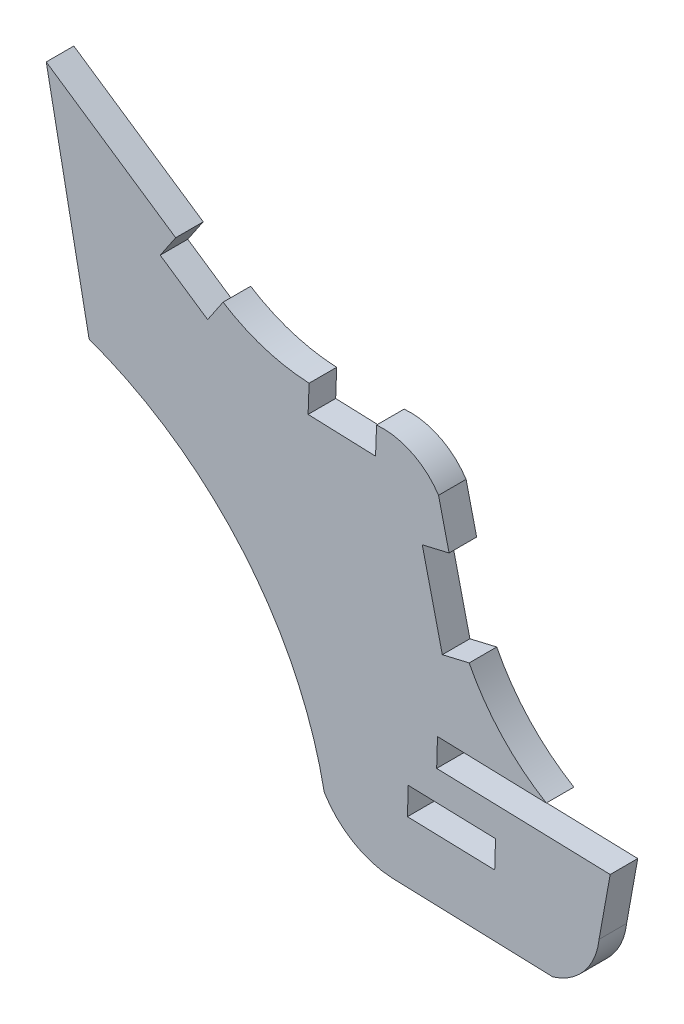
ISO-10303-21;
HEADER;
FILE_DESCRIPTION(('STEP AP214'),'2;1');
FILE_NAME('part.step','',(''),(''),'','','');
FILE_SCHEMA(('AUTOMOTIVE_DESIGN { 1 0 10303 214 1 1 1 1 }'));
ENDSEC;
DATA;
#1=APPLICATION_CONTEXT('core data for automotive mechanical design processes');
#2=APPLICATION_PROTOCOL_DEFINITION('international standard','automotive_design',2000,#1);
#3=PRODUCT_CONTEXT('',#1,'mechanical');
#4=PRODUCT('Part','Part','',(#3));
#5=PRODUCT_RELATED_PRODUCT_CATEGORY('part','',(#4));
#6=PRODUCT_DEFINITION_FORMATION('','',#4);
#7=PRODUCT_DEFINITION_CONTEXT('part definition',#1,'design');
#8=PRODUCT_DEFINITION('design','',#6,#7);
#9=PRODUCT_DEFINITION_SHAPE('','',#8);
#10=(LENGTH_UNIT() NAMED_UNIT(*) SI_UNIT(.MILLI.,.METRE.));
#11=(NAMED_UNIT(*) PLANE_ANGLE_UNIT() SI_UNIT($,.RADIAN.));
#12=(NAMED_UNIT(*) SI_UNIT($,.STERADIAN.) SOLID_ANGLE_UNIT());
#13=UNCERTAINTY_MEASURE_WITH_UNIT(LENGTH_MEASURE(1.E-05),#10,'distance_accuracy_value','');
#14=(GEOMETRIC_REPRESENTATION_CONTEXT(3) GLOBAL_UNCERTAINTY_ASSIGNED_CONTEXT((#13)) GLOBAL_UNIT_ASSIGNED_CONTEXT((#10,
#11,#12)) REPRESENTATION_CONTEXT('',''));
#15=CARTESIAN_POINT('',(0.,0.,0.));
#16=DIRECTION('',(0.,0.,1.));
#17=DIRECTION('',(1.,0.,0.));
#18=AXIS2_PLACEMENT_3D('',#15,#16,#17);
#19=CARTESIAN_POINT('',(468.96789565381,345.95297828372,3.));
#20=DIRECTION('',(0.,0.,1.));
#21=DIRECTION('',(1.,0.,0.));
#22=AXIS2_PLACEMENT_3D('',#19,#20,#21);
#23=PLANE('',#22);
#24=CARTESIAN_POINT('',(468.96789565381,345.95297828372,3.));
#25=DIRECTION('',(0.,0.,1.));
#26=DIRECTION('',(1.,0.,0.));
#27=AXIS2_PLACEMENT_3D('',#24,#25,#26);
#28=CIRCLE('',#27,9.19947991267672);
#29=CARTESIAN_POINT('',(461.126484264045,341.142292461491,3.));
#30=VERTEX_POINT('',#29);
#31=CARTESIAN_POINT('',(468.485101770501,336.76617575346,3.));
#32=VERTEX_POINT('',#31);
#33=EDGE_CURVE('E296',#30,#32,#28,.T.);
#34=ORIENTED_EDGE('',*,*,#33,.T.);
#35=DIRECTION('',(0.999455090325987,-0.0330079145277798,0.));
#36=VECTOR('',#35,1.);
#37=CARTESIAN_POINT('',(468.485101770501,336.76617575346,3.));
#38=LINE('',#37,#36);
#39=CARTESIAN_POINT('',(485.987733807601,336.188135391384,3.));
#40=VERTEX_POINT('',#39);
#41=EDGE_CURVE('E299',#32,#40,#38,.T.);
#42=ORIENTED_EDGE('',*,*,#41,.T.);
#43=CARTESIAN_POINT('',(483.92624753236,343.027897426941,3.));
#44=DIRECTION('',(0.,0.,1.));
#45=DIRECTION('',(1.,0.,0.));
#46=AXIS2_PLACEMENT_3D('',#43,#44,#45);
#47=CIRCLE('',#46,7.14367345040774);
#48=CARTESIAN_POINT('',(491.026498899204,342.241449149119,3.));
#49=VERTEX_POINT('',#48);
#50=EDGE_CURVE('E301',#40,#49,#47,.T.);
#51=ORIENTED_EDGE('',*,*,#50,.T.);
#52=DIRECTION('',(0.177327900129265,0.984151825601998,0.));
#53=VECTOR('',#52,1.);
#54=CARTESIAN_POINT('',(491.026498899204,342.241449149119,3.));
#55=LINE('',#54,#53);
#56=CARTESIAN_POINT('',(492.238136306161,348.965913630768,3.));
#57=VERTEX_POINT('',#56);
#58=EDGE_CURVE('E303',#49,#57,#55,.T.);
#59=ORIENTED_EDGE('',*,*,#58,.T.);
#60=DIRECTION('',(-0.999570165264995,0.0293169696952204,0.));
#61=VECTOR('',#60,1.);
#62=CARTESIAN_POINT('',(492.238136306161,348.965913630768,3.));
#63=LINE('',#62,#61);
#64=CARTESIAN_POINT('',(473.355716317311,349.519727013582,3.));
#65=VERTEX_POINT('',#64);
#66=EDGE_CURVE('E305',#57,#65,#63,.T.);
#67=ORIENTED_EDGE('',*,*,#66,.T.);
#68=DIRECTION('',(0.0293169696952107,0.999570165264995,0.));
#69=VECTOR('',#68,1.);
#70=CARTESIAN_POINT('',(473.355716317311,349.519727013582,3.));
#71=LINE('',#70,#69);
#72=CARTESIAN_POINT('',(473.445174068195,352.569813695993,3.));
#73=VERTEX_POINT('',#72);
#74=EDGE_CURVE('E307',#65,#73,#71,.T.);
#75=ORIENTED_EDGE('',*,*,#74,.T.);
#76=DIRECTION('',(0.999570165264995,-0.0293169696952187,0.));
#77=VECTOR('',#76,1.);
#78=CARTESIAN_POINT('',(473.445174068195,352.569813695993,3.));
#79=LINE('',#78,#77);
#80=CARTESIAN_POINT('',(485.286157605882,352.222522662708,3.));
#81=VERTEX_POINT('',#80);
#82=EDGE_CURVE('E309',#73,#81,#79,.T.);
#83=ORIENTED_EDGE('',*,*,#82,.T.);
#84=CARTESIAN_POINT('',(496.747935532261,371.31733561214,3.));
#85=DIRECTION('',(0.,0.,-1.));
#86=DIRECTION('',(1.,0.,0.));
#87=AXIS2_PLACEMENT_3D('',#84,#85,#86);
#88=CIRCLE('',#87,22.2707035094855);
#89=CARTESIAN_POINT('',(476.892234143935,361.230940954731,3.));
#90=VERTEX_POINT('',#89);
#91=EDGE_CURVE('E311',#81,#90,#88,.T.);
#92=ORIENTED_EDGE('',*,*,#91,.T.);
#93=DIRECTION('',(-0.973400938066721,-0.22910830140095,0.));
#94=VECTOR('',#93,1.);
#95=CARTESIAN_POINT('',(473.972031329734,360.543616050528,3.));
#96=LINE('',#95,#94);
#97=CARTESIAN_POINT('',(473.972031329734,360.543616050528,3.));
#98=VERTEX_POINT('',#97);
#99=EDGE_CURVE('E313',#90,#98,#96,.T.);
#100=ORIENTED_EDGE('',*,*,#99,.T.);
#101=DIRECTION('',(-0.229108301400947,0.973400938066721,0.));
#102=VECTOR('',#101,1.);
#103=CARTESIAN_POINT('',(471.790920300397,369.810392980924,3.));
#104=LINE('',#103,#102);
#105=CARTESIAN_POINT('',(471.790920300397,369.810392980924,3.));
#106=VERTEX_POINT('',#105);
#107=EDGE_CURVE('E315',#98,#106,#104,.T.);
#108=ORIENTED_EDGE('',*,*,#107,.T.);
#109=DIRECTION('',(0.973400938066721,0.229108301400947,0.));
#110=VECTOR('',#109,1.);
#111=CARTESIAN_POINT('',(471.790920300397,369.810392980924,3.));
#112=LINE('',#111,#110);
#113=CARTESIAN_POINT('',(474.705571911738,370.496411304654,3.));
#114=VERTEX_POINT('',#113);
#115=EDGE_CURVE('E317',#106,#114,#112,.T.);
#116=ORIENTED_EDGE('',*,*,#115,.T.);
#117=DIRECTION('',(-0.22910830140094,0.973400938066723,0.));
#118=VECTOR('',#117,1.);
#119=CARTESIAN_POINT('',(474.705571911738,370.496411304654,3.));
#120=LINE('',#119,#118);
#121=CARTESIAN_POINT('',(473.560151419854,375.362901844119,3.));
#122=VERTEX_POINT('',#121);
#123=EDGE_CURVE('E319',#114,#122,#120,.T.);
#124=ORIENTED_EDGE('',*,*,#123,.T.);
#125=CARTESIAN_POINT('',(467.477722075814,371.364785984137,3.));
#126=DIRECTION('',(0.,0.,1.));
#127=DIRECTION('',(1.,0.,0.));
#128=AXIS2_PLACEMENT_3D('',#125,#126,#127);
#129=CIRCLE('',#128,7.27879640840974);
#130=CARTESIAN_POINT('',(466.815212768636,378.613369195564,3.));
#131=VERTEX_POINT('',#130);
#132=EDGE_CURVE('E321',#122,#131,#129,.T.);
#133=ORIENTED_EDGE('',*,*,#132,.T.);
#134=DIRECTION('',(-0.036807561488547,-0.999322372118861,0.));
#135=VECTOR('',#134,1.);
#136=CARTESIAN_POINT('',(466.789188286835,377.906806580836,3.));
#137=LINE('',#136,#135);
#138=CARTESIAN_POINT('',(466.704790084171,375.615402079207,3.));
#139=VERTEX_POINT('',#138);
#140=EDGE_CURVE('E323',#131,#139,#137,.T.);
#141=ORIENTED_EDGE('',*,*,#140,.T.);
#142=DIRECTION('',(-0.999322372118862,0.0368075614885065,0.));
#143=VECTOR('',#142,1.);
#144=CARTESIAN_POINT('',(466.704790084171,375.615402079207,3.));
#145=LINE('',#144,#143);
#146=CARTESIAN_POINT('',(459.364790084171,375.885752777704,3.));
#147=VERTEX_POINT('',#146);
#148=EDGE_CURVE('E325',#139,#147,#145,.T.);
#149=ORIENTED_EDGE('',*,*,#148,.T.);
#150=DIRECTION('',(0.0368075614884959,0.999322372118863,0.));
#151=VECTOR('',#150,1.);
#152=CARTESIAN_POINT('',(459.364790084171,375.885752777704,3.));
#153=LINE('',#152,#151);
#154=CARTESIAN_POINT('',(459.475212768636,378.88371989406,3.));
#155=VERTEX_POINT('',#154);
#156=EDGE_CURVE('E327',#147,#155,#153,.T.);
#157=ORIENTED_EDGE('',*,*,#156,.T.);
#158=CARTESIAN_POINT('',(460.323516716727,397.881152780457,3.));
#159=DIRECTION('',(0.,0.,-1.));
#160=DIRECTION('',(1.,0.,0.));
#161=AXIS2_PLACEMENT_3D('',#158,#159,#160);
#162=CIRCLE('',#161,19.0163633710941);
#163=CARTESIAN_POINT('',(450.113675125507,381.838048014119,3.));
#164=VERTEX_POINT('',#163);
#165=EDGE_CURVE('E329',#155,#164,#162,.T.);
#166=ORIENTED_EDGE('',*,*,#165,.T.);
#167=DIRECTION('',(-0.560341990213033,-0.828261344023792,0.));
#168=VECTOR('',#167,1.);
#169=CARTESIAN_POINT('',(448.432649154868,379.353263982048,3.));
#170=LINE('',#169,#168);
#171=CARTESIAN_POINT('',(448.432649154868,379.353263982048,3.));
#172=VERTEX_POINT('',#171);
#173=EDGE_CURVE('E331',#164,#172,#170,.T.);
#174=ORIENTED_EDGE('',*,*,#173,.T.);
#175=DIRECTION('',(-0.828261344023792,0.560341990213031,0.));
#176=VECTOR('',#175,1.);
#177=CARTESIAN_POINT('',(448.432649154868,379.353263982048,3.));
#178=LINE('',#177,#176);
#179=CARTESIAN_POINT('',(443.2725809816,382.844194581075,3.));
#180=VERTEX_POINT('',#179);
#181=EDGE_CURVE('E333',#172,#180,#178,.T.);
#182=ORIENTED_EDGE('',*,*,#181,.T.);
#183=DIRECTION('',(0.560341990213037,0.828261344023789,0.));
#184=VECTOR('',#183,1.);
#185=CARTESIAN_POINT('',(443.2725809816,382.844194581075,3.));
#186=LINE('',#185,#184);
#187=CARTESIAN_POINT('',(444.953606952239,385.328978613146,3.));
#188=VERTEX_POINT('',#187);
#189=EDGE_CURVE('E335',#180,#188,#186,.T.);
#190=ORIENTED_EDGE('',*,*,#189,.T.);
#191=DIRECTION('',(-0.828261344023787,0.560341990213039,0.));
#192=VECTOR('',#191,1.);
#193=CARTESIAN_POINT('',(444.953606952239,385.328978613146,3.));
#194=LINE('',#193,#192);
#195=CARTESIAN_POINT('',(430.870547604675,394.85656258171,3.));
#196=VERTEX_POINT('',#195);
#197=EDGE_CURVE('E337',#188,#196,#194,.T.);
#198=ORIENTED_EDGE('',*,*,#197,.T.);
#199=DIRECTION('',(0.19231078912627,-0.981334071754177,0.));
#200=VECTOR('',#199,1.);
#201=CARTESIAN_POINT('',(431.688843489573,390.680917334372,3.));
#202=LINE('',#201,#200);
#203=CARTESIAN_POINT('',(435.532374472132,371.06793604422,3.));
#204=VERTEX_POINT('',#203);
#205=EDGE_CURVE('E339',#196,#204,#202,.T.);
#206=ORIENTED_EDGE('',*,*,#205,.T.);
#207=CARTESIAN_POINT('',(421.868375480799,333.474118313577,3.));
#208=DIRECTION('',(0.,0.,-1.));
#209=DIRECTION('',(1.,0.,0.));
#210=AXIS2_PLACEMENT_3D('',#207,#208,#209);
#211=CIRCLE('',#210,39.9999999999991);
#212=EDGE_CURVE('E341',#204,#30,#211,.T.);
#213=ORIENTED_EDGE('',*,*,#212,.T.);
#214=EDGE_LOOP('',(#34,#42,#51,#59,#67,#75,#83,#92,#100,#108,#116,#124,#133,#141,#149,#157,#166,
#174,#182,#190,#198,#206,#213));
#215=FACE_BOUND('',#214,.T.);
#216=DIRECTION('',(0.999570902873321,-0.0292918099306445,0.));
#217=VECTOR('',#216,1.);
#218=CARTESIAN_POINT('',(470.175766233134,343.382194877736,3.));
#219=LINE('',#218,#217);
#220=CARTESIAN_POINT('',(470.175766233134,343.382194877736,3.));
#221=VERTEX_POINT('',#220);
#222=CARTESIAN_POINT('',(479.671689810431,343.103922683395,3.));
#223=VERTEX_POINT('',#222);
#224=EDGE_CURVE('E237',#221,#223,#219,.T.);
#225=ORIENTED_EDGE('',*,*,#224,.F.);
#226=DIRECTION('',(-0.0292918099306476,-0.999570902873321,0.));
#227=VECTOR('',#226,1.);
#228=CARTESIAN_POINT('',(470.263641662926,346.380907586355,3.));
#229=LINE('',#228,#227);
#230=CARTESIAN_POINT('',(470.263641662926,346.380907586355,3.));
#231=VERTEX_POINT('',#230);
#232=EDGE_CURVE('E226',#231,#221,#229,.T.);
#233=ORIENTED_EDGE('',*,*,#232,.F.);
#234=DIRECTION('',(-0.999570902873321,0.0292918099306445,0.));
#235=VECTOR('',#234,1.);
#236=CARTESIAN_POINT('',(479.759565240223,346.102635392014,3.));
#237=LINE('',#236,#235);
#238=CARTESIAN_POINT('',(479.759565240223,346.102635392014,3.));
#239=VERTEX_POINT('',#238);
#240=EDGE_CURVE('E241',#239,#231,#237,.T.);
#241=ORIENTED_EDGE('',*,*,#240,.F.);
#242=DIRECTION('',(0.0292918099306476,0.999570902873321,0.));
#243=VECTOR('',#242,1.);
#244=CARTESIAN_POINT('',(479.671689810431,343.103922683395,3.));
#245=LINE('',#244,#243);
#246=EDGE_CURVE('E239',#223,#239,#245,.T.);
#247=ORIENTED_EDGE('',*,*,#246,.F.);
#248=EDGE_LOOP('',(#225,#233,#241,#247));
#249=FACE_BOUND('',#248,.T.);
#250=ADVANCED_FACE('F32',(#215,#249),#23,.T.);
#251=CARTESIAN_POINT('',(468.96789565381,345.95297828372,0.));
#252=DIRECTION('',(0.,0.,1.));
#253=DIRECTION('',(1.,0.,0.));
#254=AXIS2_PLACEMENT_3D('',#251,#252,#253);
#255=PLANE('',#254);
#256=CARTESIAN_POINT('',(468.96789565381,345.95297828372,0.));
#257=DIRECTION('',(0.,0.,1.));
#258=DIRECTION('',(1.,0.,0.));
#259=AXIS2_PLACEMENT_3D('',#256,#257,#258);
#260=CIRCLE('',#259,9.19947991267672);
#261=CARTESIAN_POINT('',(461.126484264045,341.142292461491,0.));
#262=VERTEX_POINT('',#261);
#263=CARTESIAN_POINT('',(468.485101770501,336.76617575346,0.));
#264=VERTEX_POINT('',#263);
#265=EDGE_CURVE('E227',#262,#264,#260,.T.);
#266=ORIENTED_EDGE('',*,*,#265,.F.);
#267=CARTESIAN_POINT('',(421.868375480799,333.474118313577,0.));
#268=DIRECTION('',(0.,0.,-1.));
#269=DIRECTION('',(1.,0.,0.));
#270=AXIS2_PLACEMENT_3D('',#267,#268,#269);
#271=CIRCLE('',#270,39.9999999999991);
#272=CARTESIAN_POINT('',(435.532374472132,371.06793604422,0.));
#273=VERTEX_POINT('',#272);
#274=EDGE_CURVE('E294',#273,#262,#271,.T.);
#275=ORIENTED_EDGE('',*,*,#274,.F.);
#276=DIRECTION('',(0.192310789126264,-0.981334071754178,0.));
#277=VECTOR('',#276,1.);
#278=CARTESIAN_POINT('',(431.688843489573,390.680917334372,0.));
#279=LINE('',#278,#277);
#280=CARTESIAN_POINT('',(430.870547604675,394.85656258171,0.));
#281=VERTEX_POINT('',#280);
#282=EDGE_CURVE('E292',#281,#273,#279,.T.);
#283=ORIENTED_EDGE('',*,*,#282,.F.);
#284=DIRECTION('',(-0.828261344023787,0.560341990213039,0.));
#285=VECTOR('',#284,1.);
#286=CARTESIAN_POINT('',(433.369869460212,393.165701366443,0.));
#287=LINE('',#286,#285);
#288=CARTESIAN_POINT('',(444.953606952239,385.328978613146,0.));
#289=VERTEX_POINT('',#288);
#290=EDGE_CURVE('E289',#289,#281,#287,.T.);
#291=ORIENTED_EDGE('',*,*,#290,.F.);
#292=DIRECTION('',(0.560341990213037,0.828261344023789,0.));
#293=VECTOR('',#292,1.);
#294=CARTESIAN_POINT('',(443.2725809816,382.844194581075,0.));
#295=LINE('',#294,#293);
#296=CARTESIAN_POINT('',(443.2725809816,382.844194581075,0.));
#297=VERTEX_POINT('',#296);
#298=EDGE_CURVE('E286',#297,#289,#295,.T.);
#299=ORIENTED_EDGE('',*,*,#298,.F.);
#300=DIRECTION('',(-0.828261344023792,0.560341990213031,0.));
#301=VECTOR('',#300,1.);
#302=CARTESIAN_POINT('',(448.432649154868,379.353263982048,0.));
#303=LINE('',#302,#301);
#304=CARTESIAN_POINT('',(448.432649154868,379.353263982048,0.));
#305=VERTEX_POINT('',#304);
#306=EDGE_CURVE('E284',#305,#297,#303,.T.);
#307=ORIENTED_EDGE('',*,*,#306,.F.);
#308=DIRECTION('',(-0.560341990213033,-0.828261344023792,0.));
#309=VECTOR('',#308,1.);
#310=CARTESIAN_POINT('',(448.432649154868,379.353263982048,0.));
#311=LINE('',#310,#309);
#312=CARTESIAN_POINT('',(450.113675125507,381.838048014119,0.));
#313=VERTEX_POINT('',#312);
#314=EDGE_CURVE('E282',#313,#305,#311,.T.);
#315=ORIENTED_EDGE('',*,*,#314,.F.);
#316=CARTESIAN_POINT('',(460.323516716727,397.881152780457,0.));
#317=DIRECTION('',(0.,0.,-1.));
#318=DIRECTION('',(1.,0.,0.));
#319=AXIS2_PLACEMENT_3D('',#316,#317,#318);
#320=CIRCLE('',#319,19.0163633710941);
#321=CARTESIAN_POINT('',(459.475212768636,378.88371989406,0.));
#322=VERTEX_POINT('',#321);
#323=EDGE_CURVE('E280',#322,#313,#320,.T.);
#324=ORIENTED_EDGE('',*,*,#323,.F.);
#325=DIRECTION('',(0.0368075614884959,0.999322372118863,0.));
#326=VECTOR('',#325,1.);
#327=CARTESIAN_POINT('',(459.364790084171,375.885752777704,0.));
#328=LINE('',#327,#326);
#329=CARTESIAN_POINT('',(459.364790084171,375.885752777704,0.));
#330=VERTEX_POINT('',#329);
#331=EDGE_CURVE('E278',#330,#322,#328,.T.);
#332=ORIENTED_EDGE('',*,*,#331,.F.);
#333=DIRECTION('',(-0.999322372118862,0.0368075614885065,0.));
#334=VECTOR('',#333,1.);
#335=CARTESIAN_POINT('',(466.704790084171,375.615402079207,0.));
#336=LINE('',#335,#334);
#337=CARTESIAN_POINT('',(466.704790084171,375.615402079207,0.));
#338=VERTEX_POINT('',#337);
#339=EDGE_CURVE('E276',#338,#330,#336,.T.);
#340=ORIENTED_EDGE('',*,*,#339,.F.);
#341=DIRECTION('',(-0.0368075614885204,-0.999322372118862,0.));
#342=VECTOR('',#341,1.);
#343=CARTESIAN_POINT('',(466.789188286835,377.906806580836,0.));
#344=LINE('',#343,#342);
#345=CARTESIAN_POINT('',(466.815212768636,378.613369195564,0.));
#346=VERTEX_POINT('',#345);
#347=EDGE_CURVE('E274',#346,#338,#344,.T.);
#348=ORIENTED_EDGE('',*,*,#347,.F.);
#349=CARTESIAN_POINT('',(467.477722075814,371.364785984137,0.));
#350=DIRECTION('',(0.,0.,1.));
#351=DIRECTION('',(1.,0.,0.));
#352=AXIS2_PLACEMENT_3D('',#349,#350,#351);
#353=CIRCLE('',#352,7.27879640840974);
#354=CARTESIAN_POINT('',(473.560151419854,375.362901844119,0.));
#355=VERTEX_POINT('',#354);
#356=EDGE_CURVE('E271',#355,#346,#353,.T.);
#357=ORIENTED_EDGE('',*,*,#356,.F.);
#358=DIRECTION('',(-0.22910830140094,0.973400938066723,0.));
#359=VECTOR('',#358,1.);
#360=CARTESIAN_POINT('',(474.705571911738,370.496411304654,0.));
#361=LINE('',#360,#359);
#362=CARTESIAN_POINT('',(474.705571911738,370.496411304654,0.));
#363=VERTEX_POINT('',#362);
#364=EDGE_CURVE('E269',#363,#355,#361,.T.);
#365=ORIENTED_EDGE('',*,*,#364,.F.);
#366=DIRECTION('',(0.973400938066721,0.229108301400947,0.));
#367=VECTOR('',#366,1.);
#368=CARTESIAN_POINT('',(471.790920300397,369.810392980924,0.));
#369=LINE('',#368,#367);
#370=CARTESIAN_POINT('',(471.790920300397,369.810392980924,0.));
#371=VERTEX_POINT('',#370);
#372=EDGE_CURVE('E267',#371,#363,#369,.T.);
#373=ORIENTED_EDGE('',*,*,#372,.F.);
#374=DIRECTION('',(-0.229108301400947,0.973400938066721,0.));
#375=VECTOR('',#374,1.);
#376=CARTESIAN_POINT('',(471.790920300397,369.810392980924,0.));
#377=LINE('',#376,#375);
#378=CARTESIAN_POINT('',(473.972031329734,360.543616050528,0.));
#379=VERTEX_POINT('',#378);
#380=EDGE_CURVE('E265',#379,#371,#377,.T.);
#381=ORIENTED_EDGE('',*,*,#380,.F.);
#382=DIRECTION('',(-0.973400938066721,-0.22910830140095,0.));
#383=VECTOR('',#382,1.);
#384=CARTESIAN_POINT('',(473.972031329734,360.543616050528,0.));
#385=LINE('',#384,#383);
#386=CARTESIAN_POINT('',(476.892234143935,361.230940954731,0.));
#387=VERTEX_POINT('',#386);
#388=EDGE_CURVE('E263',#387,#379,#385,.T.);
#389=ORIENTED_EDGE('',*,*,#388,.F.);
#390=CARTESIAN_POINT('',(496.747935532261,371.31733561214,0.));
#391=DIRECTION('',(0.,0.,-1.));
#392=DIRECTION('',(1.,0.,0.));
#393=AXIS2_PLACEMENT_3D('',#390,#391,#392);
#394=CIRCLE('',#393,22.2707035094855);
#395=CARTESIAN_POINT('',(485.286157605882,352.222522662708,0.));
#396=VERTEX_POINT('',#395);
#397=EDGE_CURVE('E261',#396,#387,#394,.T.);
#398=ORIENTED_EDGE('',*,*,#397,.F.);
#399=DIRECTION('',(0.999570165264995,-0.0293169696952187,0.));
#400=VECTOR('',#399,1.);
#401=CARTESIAN_POINT('',(473.445174068195,352.569813695993,0.));
#402=LINE('',#401,#400);
#403=CARTESIAN_POINT('',(473.445174068195,352.569813695993,0.));
#404=VERTEX_POINT('',#403);
#405=EDGE_CURVE('E259',#404,#396,#402,.T.);
#406=ORIENTED_EDGE('',*,*,#405,.F.);
#407=DIRECTION('',(0.0293169696952107,0.999570165264995,0.));
#408=VECTOR('',#407,1.);
#409=CARTESIAN_POINT('',(473.355716317311,349.519727013582,0.));
#410=LINE('',#409,#408);
#411=CARTESIAN_POINT('',(473.355716317311,349.519727013582,0.));
#412=VERTEX_POINT('',#411);
#413=EDGE_CURVE('E257',#412,#404,#410,.T.);
#414=ORIENTED_EDGE('',*,*,#413,.F.);
#415=DIRECTION('',(-0.999570165264995,0.0293169696952204,0.));
#416=VECTOR('',#415,1.);
#417=CARTESIAN_POINT('',(492.238136306161,348.965913630768,0.));
#418=LINE('',#417,#416);
#419=CARTESIAN_POINT('',(492.238136306161,348.965913630768,0.));
#420=VERTEX_POINT('',#419);
#421=EDGE_CURVE('E255',#420,#412,#418,.T.);
#422=ORIENTED_EDGE('',*,*,#421,.F.);
#423=DIRECTION('',(0.177327900129265,0.984151825601998,0.));
#424=VECTOR('',#423,1.);
#425=CARTESIAN_POINT('',(491.026498899204,342.241449149119,0.));
#426=LINE('',#425,#424);
#427=CARTESIAN_POINT('',(491.026498899204,342.241449149119,0.));
#428=VERTEX_POINT('',#427);
#429=EDGE_CURVE('E253',#428,#420,#426,.T.);
#430=ORIENTED_EDGE('',*,*,#429,.F.);
#431=CARTESIAN_POINT('',(483.92624753236,343.027897426941,0.));
#432=DIRECTION('',(0.,0.,1.));
#433=DIRECTION('',(1.,0.,0.));
#434=AXIS2_PLACEMENT_3D('',#431,#432,#433);
#435=CIRCLE('',#434,7.14367345040774);
#436=CARTESIAN_POINT('',(485.987733807601,336.188135391384,0.));
#437=VERTEX_POINT('',#436);
#438=EDGE_CURVE('E251',#437,#428,#435,.T.);
#439=ORIENTED_EDGE('',*,*,#438,.F.);
#440=DIRECTION('',(0.999455090325987,-0.0330079145277798,0.));
#441=VECTOR('',#440,1.);
#442=CARTESIAN_POINT('',(468.485101770501,336.76617575346,0.));
#443=LINE('',#442,#441);
#444=EDGE_CURVE('E249',#264,#437,#443,.T.);
#445=ORIENTED_EDGE('',*,*,#444,.F.);
#446=EDGE_LOOP('',(#266,#275,#283,#291,#299,#307,#315,#324,#332,#340,#348,#357,#365,#373,#381,
#389,#398,#406,#414,#422,#430,#439,#445));
#447=FACE_BOUND('',#446,.T.);
#448=DIRECTION('',(-0.0292918099306476,-0.999570902873321,0.));
#449=VECTOR('',#448,1.);
#450=CARTESIAN_POINT('',(470.263641662926,346.380907586355,0.));
#451=LINE('',#450,#449);
#452=CARTESIAN_POINT('',(470.263641662926,346.380907586355,0.));
#453=VERTEX_POINT('',#452);
#454=CARTESIAN_POINT('',(470.175766233134,343.382194877736,0.));
#455=VERTEX_POINT('',#454);
#456=EDGE_CURVE('E55',#453,#455,#451,.T.);
#457=ORIENTED_EDGE('',*,*,#456,.T.);
#458=DIRECTION('',(0.999570902873321,-0.0292918099306445,0.));
#459=VECTOR('',#458,1.);
#460=CARTESIAN_POINT('',(470.175766233134,343.382194877736,0.));
#461=LINE('',#460,#459);
#462=CARTESIAN_POINT('',(479.671689810431,343.103922683395,0.));
#463=VERTEX_POINT('',#462);
#464=EDGE_CURVE('E213',#455,#463,#461,.T.);
#465=ORIENTED_EDGE('',*,*,#464,.T.);
#466=DIRECTION('',(0.0292918099306476,0.999570902873321,0.));
#467=VECTOR('',#466,1.);
#468=CARTESIAN_POINT('',(479.671689810431,343.103922683395,0.));
#469=LINE('',#468,#467);
#470=CARTESIAN_POINT('',(479.759565240223,346.102635392014,0.));
#471=VERTEX_POINT('',#470);
#472=EDGE_CURVE('E222',#463,#471,#469,.T.);
#473=ORIENTED_EDGE('',*,*,#472,.T.);
#474=DIRECTION('',(-0.999570902873321,0.0292918099306445,0.));
#475=VECTOR('',#474,1.);
#476=CARTESIAN_POINT('',(479.759565240223,346.102635392014,0.));
#477=LINE('',#476,#475);
#478=EDGE_CURVE('E231',#471,#453,#477,.T.);
#479=ORIENTED_EDGE('',*,*,#478,.T.);
#480=EDGE_LOOP('',(#457,#465,#473,#479));
#481=FACE_BOUND('',#480,.T.);
#482=ADVANCED_FACE('F230',(#447,#481),#255,.F.);
#483=CARTESIAN_POINT('',(468.96789565381,345.95297828372,3.));
#484=DIRECTION('',(0.,0.,-1.));
#485=DIRECTION('',(-1.,0.,0.));
#486=AXIS2_PLACEMENT_3D('',#483,#484,#485);
#487=CYLINDRICAL_SURFACE('',#486,9.19947991267672);
#488=ORIENTED_EDGE('',*,*,#265,.T.);
#489=DIRECTION('',(0.,0.,-1.));
#490=VECTOR('',#489,1.);
#491=CARTESIAN_POINT('',(468.485101770501,336.76617575346,3.));
#492=LINE('',#491,#490);
#493=EDGE_CURVE('E11',#32,#264,#492,.T.);
#494=ORIENTED_EDGE('',*,*,#493,.F.);
#495=ORIENTED_EDGE('',*,*,#33,.F.);
#496=DIRECTION('',(0.,0.,-1.));
#497=VECTOR('',#496,1.);
#498=CARTESIAN_POINT('',(461.126484264045,341.142292461491,3.));
#499=LINE('',#498,#497);
#500=EDGE_CURVE('E343',#30,#262,#499,.T.);
#501=ORIENTED_EDGE('',*,*,#500,.T.);
#502=EDGE_LOOP('',(#488,#494,#495,#501));
#503=FACE_BOUND('',#502,.T.);
#504=ADVANCED_FACE('F34',(#503),#487,.T.);
#505=CARTESIAN_POINT('',(468.485101770501,336.76617575346,3.));
#506=DIRECTION('',(0.0330079145277797,0.999455090325987,0.));
#507=DIRECTION('',(-0.999455090325987,0.0330079145277798,0.));
#508=AXIS2_PLACEMENT_3D('',#505,#506,#507);
#509=PLANE('',#508);
#510=ORIENTED_EDGE('',*,*,#444,.T.);
#511=DIRECTION('',(0.,0.,-1.));
#512=VECTOR('',#511,1.);
#513=CARTESIAN_POINT('',(485.987733807601,336.188135391384,3.));
#514=LINE('',#513,#512);
#515=EDGE_CURVE('E40',#40,#437,#514,.T.);
#516=ORIENTED_EDGE('',*,*,#515,.F.);
#517=ORIENTED_EDGE('',*,*,#41,.F.);
#518=ORIENTED_EDGE('',*,*,#493,.T.);
#519=EDGE_LOOP('',(#510,#516,#517,#518));
#520=FACE_BOUND('',#519,.T.);
#521=ADVANCED_FACE('F432',(#520),#509,.F.);
#522=CARTESIAN_POINT('',(483.92624753236,343.027897426941,3.));
#523=DIRECTION('',(0.,0.,-1.));
#524=DIRECTION('',(-1.,0.,0.));
#525=AXIS2_PLACEMENT_3D('',#522,#523,#524);
#526=CYLINDRICAL_SURFACE('',#525,7.14367345040774);
#527=ORIENTED_EDGE('',*,*,#438,.T.);
#528=DIRECTION('',(0.,0.,-1.));
#529=VECTOR('',#528,1.);
#530=CARTESIAN_POINT('',(491.026498899204,342.241449149119,3.));
#531=LINE('',#530,#529);
#532=EDGE_CURVE('E403',#49,#428,#531,.T.);
#533=ORIENTED_EDGE('',*,*,#532,.F.);
#534=ORIENTED_EDGE('',*,*,#50,.F.);
#535=ORIENTED_EDGE('',*,*,#515,.T.);
#536=EDGE_LOOP('',(#527,#533,#534,#535));
#537=FACE_BOUND('',#536,.T.);
#538=ADVANCED_FACE('F410',(#537),#526,.T.);
#539=CARTESIAN_POINT('',(491.026498899204,342.241449149119,3.));
#540=DIRECTION('',(-0.984151825601998,0.177327900129264,0.));
#541=DIRECTION('',(-0.177327900129265,-0.984151825601998,0.));
#542=AXIS2_PLACEMENT_3D('',#539,#540,#541);
#543=PLANE('',#542);
#544=ORIENTED_EDGE('',*,*,#429,.T.);
#545=DIRECTION('',(0.,0.,-1.));
#546=VECTOR('',#545,1.);
#547=CARTESIAN_POINT('',(492.238136306161,348.965913630768,3.));
#548=LINE('',#547,#546);
#549=EDGE_CURVE('E400',#57,#420,#548,.T.);
#550=ORIENTED_EDGE('',*,*,#549,.F.);
#551=ORIENTED_EDGE('',*,*,#58,.F.);
#552=ORIENTED_EDGE('',*,*,#532,.T.);
#553=EDGE_LOOP('',(#544,#550,#551,#552));
#554=FACE_BOUND('',#553,.T.);
#555=ADVANCED_FACE('F420',(#554),#543,.F.);
#556=CARTESIAN_POINT('',(492.238136306161,348.965913630768,3.));
#557=DIRECTION('',(-0.0293169696952204,-0.999570165264995,0.));
#558=DIRECTION('',(0.999570165264995,-0.0293169696952204,0.));
#559=AXIS2_PLACEMENT_3D('',#556,#557,#558);
#560=PLANE('',#559);
#561=ORIENTED_EDGE('',*,*,#421,.T.);
#562=DIRECTION('',(0.,0.,-1.));
#563=VECTOR('',#562,1.);
#564=CARTESIAN_POINT('',(473.355716317311,349.519727013582,3.));
#565=LINE('',#564,#563);
#566=EDGE_CURVE('E397',#65,#412,#565,.T.);
#567=ORIENTED_EDGE('',*,*,#566,.F.);
#568=ORIENTED_EDGE('',*,*,#66,.F.);
#569=ORIENTED_EDGE('',*,*,#549,.T.);
#570=EDGE_LOOP('',(#561,#567,#568,#569));
#571=FACE_BOUND('',#570,.T.);
#572=ADVANCED_FACE('F424',(#571),#560,.F.);
#573=CARTESIAN_POINT('',(473.355716317311,349.519727013582,3.));
#574=DIRECTION('',(-0.999570165264995,0.0293169696952107,0.));
#575=DIRECTION('',(-0.0293169696952107,-0.999570165264995,0.));
#576=AXIS2_PLACEMENT_3D('',#573,#574,#575);
#577=PLANE('',#576);
#578=ORIENTED_EDGE('',*,*,#413,.T.);
#579=DIRECTION('',(0.,0.,-1.));
#580=VECTOR('',#579,1.);
#581=CARTESIAN_POINT('',(473.445174068195,352.569813695993,3.));
#582=LINE('',#581,#580);
#583=EDGE_CURVE('E394',#73,#404,#582,.T.);
#584=ORIENTED_EDGE('',*,*,#583,.F.);
#585=ORIENTED_EDGE('',*,*,#74,.F.);
#586=ORIENTED_EDGE('',*,*,#566,.T.);
#587=EDGE_LOOP('',(#578,#584,#585,#586));
#588=FACE_BOUND('',#587,.T.);
#589=ADVANCED_FACE('F517',(#588),#577,.F.);
#590=CARTESIAN_POINT('',(473.445174068195,352.569813695993,3.));
#591=DIRECTION('',(0.0293169696952187,0.999570165264995,0.));
#592=DIRECTION('',(-0.999570165264995,0.0293169696952187,0.));
#593=AXIS2_PLACEMENT_3D('',#590,#591,#592);
#594=PLANE('',#593);
#595=ORIENTED_EDGE('',*,*,#405,.T.);
#596=DIRECTION('',(0.,0.,-1.));
#597=VECTOR('',#596,1.);
#598=CARTESIAN_POINT('',(485.286157605882,352.222522662708,3.));
#599=LINE('',#598,#597);
#600=EDGE_CURVE('E391',#81,#396,#599,.T.);
#601=ORIENTED_EDGE('',*,*,#600,.F.);
#602=ORIENTED_EDGE('',*,*,#82,.F.);
#603=ORIENTED_EDGE('',*,*,#583,.T.);
#604=EDGE_LOOP('',(#595,#601,#602,#603));
#605=FACE_BOUND('',#604,.T.);
#606=ADVANCED_FACE('F515',(#605),#594,.F.);
#607=CARTESIAN_POINT('',(496.747935532261,371.31733561214,3.));
#608=DIRECTION('',(0.,0.,-1.));
#609=DIRECTION('',(-1.,0.,0.));
#610=AXIS2_PLACEMENT_3D('',#607,#608,#609);
#611=CYLINDRICAL_SURFACE('',#610,22.2707035094855);
#612=ORIENTED_EDGE('',*,*,#397,.T.);
#613=DIRECTION('',(0.,0.,-1.));
#614=VECTOR('',#613,1.);
#615=CARTESIAN_POINT('',(476.892234143935,361.230940954731,3.));
#616=LINE('',#615,#614);
#617=EDGE_CURVE('E388',#90,#387,#616,.T.);
#618=ORIENTED_EDGE('',*,*,#617,.F.);
#619=ORIENTED_EDGE('',*,*,#91,.F.);
#620=ORIENTED_EDGE('',*,*,#600,.T.);
#621=EDGE_LOOP('',(#612,#618,#619,#620));
#622=FACE_BOUND('',#621,.T.);
#623=ADVANCED_FACE('F511',(#622),#611,.F.);
#624=CARTESIAN_POINT('',(473.972031329734,360.543616050528,3.));
#625=DIRECTION('',(0.22910830140095,-0.97340093806672,0.));
#626=DIRECTION('',(0.973400938066721,0.22910830140095,0.));
#627=AXIS2_PLACEMENT_3D('',#624,#625,#626);
#628=PLANE('',#627);
#629=ORIENTED_EDGE('',*,*,#388,.T.);
#630=DIRECTION('',(0.,0.,-1.));
#631=VECTOR('',#630,1.);
#632=CARTESIAN_POINT('',(473.972031329734,360.543616050528,3.));
#633=LINE('',#632,#631);
#634=EDGE_CURVE('E385',#98,#379,#633,.T.);
#635=ORIENTED_EDGE('',*,*,#634,.F.);
#636=ORIENTED_EDGE('',*,*,#99,.F.);
#637=ORIENTED_EDGE('',*,*,#617,.T.);
#638=EDGE_LOOP('',(#629,#635,#636,#637));
#639=FACE_BOUND('',#638,.T.);
#640=ADVANCED_FACE('F506',(#639),#628,.F.);
#641=CARTESIAN_POINT('',(471.790920300397,369.810392980924,3.));
#642=DIRECTION('',(-0.973400938066721,-0.229108301400947,0.));
#643=DIRECTION('',(0.229108301400947,-0.973400938066721,0.));
#644=AXIS2_PLACEMENT_3D('',#641,#642,#643);
#645=PLANE('',#644);
#646=ORIENTED_EDGE('',*,*,#380,.T.);
#647=DIRECTION('',(0.,0.,-1.));
#648=VECTOR('',#647,1.);
#649=CARTESIAN_POINT('',(471.790920300397,369.810392980924,3.));
#650=LINE('',#649,#648);
#651=EDGE_CURVE('E382',#106,#371,#650,.T.);
#652=ORIENTED_EDGE('',*,*,#651,.F.);
#653=ORIENTED_EDGE('',*,*,#107,.F.);
#654=ORIENTED_EDGE('',*,*,#634,.T.);
#655=EDGE_LOOP('',(#646,#652,#653,#654));
#656=FACE_BOUND('',#655,.T.);
#657=ADVANCED_FACE('F500',(#656),#645,.F.);
#658=CARTESIAN_POINT('',(471.790920300397,369.810392980924,3.));
#659=DIRECTION('',(-0.229108301400947,0.973400938066721,0.));
#660=DIRECTION('',(-0.973400938066721,-0.229108301400947,0.));
#661=AXIS2_PLACEMENT_3D('',#658,#659,#660);
#662=PLANE('',#661);
#663=ORIENTED_EDGE('',*,*,#372,.T.);
#664=DIRECTION('',(0.,0.,-1.));
#665=VECTOR('',#664,1.);
#666=CARTESIAN_POINT('',(474.705571911738,370.496411304654,3.));
#667=LINE('',#666,#665);
#668=EDGE_CURVE('E379',#114,#363,#667,.T.);
#669=ORIENTED_EDGE('',*,*,#668,.F.);
#670=ORIENTED_EDGE('',*,*,#115,.F.);
#671=ORIENTED_EDGE('',*,*,#651,.T.);
#672=EDGE_LOOP('',(#663,#669,#670,#671));
#673=FACE_BOUND('',#672,.T.);
#674=ADVANCED_FACE('F496',(#673),#662,.F.);
#675=CARTESIAN_POINT('',(474.705571911738,370.496411304654,3.));
#676=DIRECTION('',(-0.973400938066723,-0.22910830140094,0.));
#677=DIRECTION('',(0.22910830140094,-0.973400938066723,0.));
#678=AXIS2_PLACEMENT_3D('',#675,#676,#677);
#679=PLANE('',#678);
#680=ORIENTED_EDGE('',*,*,#364,.T.);
#681=DIRECTION('',(0.,0.,-1.));
#682=VECTOR('',#681,1.);
#683=CARTESIAN_POINT('',(473.560151419854,375.362901844119,3.));
#684=LINE('',#683,#682);
#685=EDGE_CURVE('E376',#122,#355,#684,.T.);
#686=ORIENTED_EDGE('',*,*,#685,.F.);
#687=ORIENTED_EDGE('',*,*,#123,.F.);
#688=ORIENTED_EDGE('',*,*,#668,.T.);
#689=EDGE_LOOP('',(#680,#686,#687,#688));
#690=FACE_BOUND('',#689,.T.);
#691=ADVANCED_FACE('F491',(#690),#679,.F.);
#692=CARTESIAN_POINT('',(467.477722075814,371.364785984137,3.));
#693=DIRECTION('',(0.,0.,-1.));
#694=DIRECTION('',(-1.,0.,0.));
#695=AXIS2_PLACEMENT_3D('',#692,#693,#694);
#696=CYLINDRICAL_SURFACE('',#695,7.27879640840974);
#697=ORIENTED_EDGE('',*,*,#356,.T.);
#698=DIRECTION('',(0.,0.,-1.));
#699=VECTOR('',#698,1.);
#700=CARTESIAN_POINT('',(466.815212768636,378.613369195564,3.));
#701=LINE('',#700,#699);
#702=EDGE_CURVE('E373',#131,#346,#701,.T.);
#703=ORIENTED_EDGE('',*,*,#702,.F.);
#704=ORIENTED_EDGE('',*,*,#132,.F.);
#705=ORIENTED_EDGE('',*,*,#685,.T.);
#706=EDGE_LOOP('',(#697,#703,#704,#705));
#707=FACE_BOUND('',#706,.T.);
#708=ADVANCED_FACE('F485',(#707),#696,.T.);
#709=CARTESIAN_POINT('',(466.789188286835,377.906806580836,3.));
#710=DIRECTION('',(0.999322372118862,-0.0368075614885204,0.));
#711=DIRECTION('',(0.0368075614885204,0.999322372118862,0.));
#712=AXIS2_PLACEMENT_3D('',#709,#710,#711);
#713=PLANE('',#712);
#714=ORIENTED_EDGE('',*,*,#347,.T.);
#715=DIRECTION('',(0.,0.,-1.));
#716=VECTOR('',#715,1.);
#717=CARTESIAN_POINT('',(466.704790084171,375.615402079207,3.));
#718=LINE('',#717,#716);
#719=EDGE_CURVE('E370',#139,#338,#718,.T.);
#720=ORIENTED_EDGE('',*,*,#719,.F.);
#721=ORIENTED_EDGE('',*,*,#140,.F.);
#722=ORIENTED_EDGE('',*,*,#702,.T.);
#723=EDGE_LOOP('',(#714,#720,#721,#722));
#724=FACE_BOUND('',#723,.T.);
#725=ADVANCED_FACE('F481',(#724),#713,.F.);
#726=CARTESIAN_POINT('',(466.704790084171,375.615402079207,3.));
#727=DIRECTION('',(-0.0368075614885065,-0.999322372118862,0.));
#728=DIRECTION('',(0.999322372118862,-0.0368075614885065,0.));
#729=AXIS2_PLACEMENT_3D('',#726,#727,#728);
#730=PLANE('',#729);
#731=ORIENTED_EDGE('',*,*,#339,.T.);
#732=DIRECTION('',(0.,0.,-1.));
#733=VECTOR('',#732,1.);
#734=CARTESIAN_POINT('',(459.364790084171,375.885752777704,3.));
#735=LINE('',#734,#733);
#736=EDGE_CURVE('E367',#147,#330,#735,.T.);
#737=ORIENTED_EDGE('',*,*,#736,.F.);
#738=ORIENTED_EDGE('',*,*,#148,.F.);
#739=ORIENTED_EDGE('',*,*,#719,.T.);
#740=EDGE_LOOP('',(#731,#737,#738,#739));
#741=FACE_BOUND('',#740,.T.);
#742=ADVANCED_FACE('F476',(#741),#730,.F.);
#743=CARTESIAN_POINT('',(459.364790084171,375.885752777704,3.));
#744=DIRECTION('',(-0.999322372118863,0.0368075614884958,0.));
#745=DIRECTION('',(-0.0368075614884959,-0.999322372118863,0.));
#746=AXIS2_PLACEMENT_3D('',#743,#744,#745);
#747=PLANE('',#746);
#748=ORIENTED_EDGE('',*,*,#331,.T.);
#749=DIRECTION('',(0.,0.,-1.));
#750=VECTOR('',#749,1.);
#751=CARTESIAN_POINT('',(459.475212768636,378.88371989406,3.));
#752=LINE('',#751,#750);
#753=EDGE_CURVE('E364',#155,#322,#752,.T.);
#754=ORIENTED_EDGE('',*,*,#753,.F.);
#755=ORIENTED_EDGE('',*,*,#156,.F.);
#756=ORIENTED_EDGE('',*,*,#736,.T.);
#757=EDGE_LOOP('',(#748,#754,#755,#756));
#758=FACE_BOUND('',#757,.T.);
#759=ADVANCED_FACE('F471',(#758),#747,.F.);
#760=CARTESIAN_POINT('',(460.323516716727,397.881152780457,3.));
#761=DIRECTION('',(0.,0.,-1.));
#762=DIRECTION('',(-1.,0.,0.));
#763=AXIS2_PLACEMENT_3D('',#760,#761,#762);
#764=CYLINDRICAL_SURFACE('',#763,19.0163633710941);
#765=ORIENTED_EDGE('',*,*,#323,.T.);
#766=DIRECTION('',(0.,0.,-1.));
#767=VECTOR('',#766,1.);
#768=CARTESIAN_POINT('',(450.113675125507,381.838048014119,3.));
#769=LINE('',#768,#767);
#770=EDGE_CURVE('E361',#164,#313,#769,.T.);
#771=ORIENTED_EDGE('',*,*,#770,.F.);
#772=ORIENTED_EDGE('',*,*,#165,.F.);
#773=ORIENTED_EDGE('',*,*,#753,.T.);
#774=EDGE_LOOP('',(#765,#771,#772,#773));
#775=FACE_BOUND('',#774,.T.);
#776=ADVANCED_FACE('F467',(#775),#764,.F.);
#777=CARTESIAN_POINT('',(448.432649154868,379.353263982048,3.));
#778=DIRECTION('',(0.828261344023792,-0.560341990213032,0.));
#779=DIRECTION('',(0.560341990213033,0.828261344023792,0.));
#780=AXIS2_PLACEMENT_3D('',#777,#778,#779);
#781=PLANE('',#780);
#782=ORIENTED_EDGE('',*,*,#314,.T.);
#783=DIRECTION('',(0.,0.,-1.));
#784=VECTOR('',#783,1.);
#785=CARTESIAN_POINT('',(448.432649154868,379.353263982048,3.));
#786=LINE('',#785,#784);
#787=EDGE_CURVE('E358',#172,#305,#786,.T.);
#788=ORIENTED_EDGE('',*,*,#787,.F.);
#789=ORIENTED_EDGE('',*,*,#173,.F.);
#790=ORIENTED_EDGE('',*,*,#770,.T.);
#791=EDGE_LOOP('',(#782,#788,#789,#790));
#792=FACE_BOUND('',#791,.T.);
#793=ADVANCED_FACE('F462',(#792),#781,.F.);
#794=CARTESIAN_POINT('',(448.432649154868,379.353263982048,3.));
#795=DIRECTION('',(-0.560341990213031,-0.828261344023792,0.));
#796=DIRECTION('',(0.828261344023792,-0.560341990213031,0.));
#797=AXIS2_PLACEMENT_3D('',#794,#795,#796);
#798=PLANE('',#797);
#799=ORIENTED_EDGE('',*,*,#306,.T.);
#800=DIRECTION('',(0.,0.,-1.));
#801=VECTOR('',#800,1.);
#802=CARTESIAN_POINT('',(443.2725809816,382.844194581075,3.));
#803=LINE('',#802,#801);
#804=EDGE_CURVE('E355',#180,#297,#803,.T.);
#805=ORIENTED_EDGE('',*,*,#804,.F.);
#806=ORIENTED_EDGE('',*,*,#181,.F.);
#807=ORIENTED_EDGE('',*,*,#787,.T.);
#808=EDGE_LOOP('',(#799,#805,#806,#807));
#809=FACE_BOUND('',#808,.T.);
#810=ADVANCED_FACE('F456',(#809),#798,.F.);
#811=CARTESIAN_POINT('',(443.2725809816,382.844194581075,3.));
#812=DIRECTION('',(-0.828261344023789,0.560341990213037,0.));
#813=DIRECTION('',(-0.560341990213037,-0.828261344023789,0.));
#814=AXIS2_PLACEMENT_3D('',#811,#812,#813);
#815=PLANE('',#814);
#816=ORIENTED_EDGE('',*,*,#298,.T.);
#817=DIRECTION('',(0.,0.,-1.));
#818=VECTOR('',#817,1.);
#819=CARTESIAN_POINT('',(444.953606952239,385.328978613146,3.));
#820=LINE('',#819,#818);
#821=EDGE_CURVE('E352',#188,#289,#820,.T.);
#822=ORIENTED_EDGE('',*,*,#821,.F.);
#823=ORIENTED_EDGE('',*,*,#189,.F.);
#824=ORIENTED_EDGE('',*,*,#804,.T.);
#825=EDGE_LOOP('',(#816,#822,#823,#824));
#826=FACE_BOUND('',#825,.T.);
#827=ADVANCED_FACE('F451',(#826),#815,.F.);
#828=CARTESIAN_POINT('',(433.369869460212,393.165701366443,3.));
#829=DIRECTION('',(-0.560341990213039,-0.828261344023787,0.));
#830=DIRECTION('',(0.828261344023787,-0.560341990213039,0.));
#831=AXIS2_PLACEMENT_3D('',#828,#829,#830);
#832=PLANE('',#831);
#833=ORIENTED_EDGE('',*,*,#290,.T.);
#834=DIRECTION('',(0.,0.,-1.));
#835=VECTOR('',#834,1.);
#836=CARTESIAN_POINT('',(430.870547604675,394.85656258171,3.));
#837=LINE('',#836,#835);
#838=EDGE_CURVE('E349',#196,#281,#837,.T.);
#839=ORIENTED_EDGE('',*,*,#838,.F.);
#840=ORIENTED_EDGE('',*,*,#197,.F.);
#841=ORIENTED_EDGE('',*,*,#821,.T.);
#842=EDGE_LOOP('',(#833,#839,#840,#841));
#843=FACE_BOUND('',#842,.T.);
#844=ADVANCED_FACE('F446',(#843),#832,.F.);
#845=CARTESIAN_POINT('',(431.688843489573,390.680917334372,3.));
#846=DIRECTION('',(0.981334071754178,0.192310789126264,0.));
#847=DIRECTION('',(-0.192310789126264,0.981334071754178,0.));
#848=AXIS2_PLACEMENT_3D('',#845,#846,#847);
#849=PLANE('',#848);
#850=ORIENTED_EDGE('',*,*,#282,.T.);
#851=DIRECTION('',(0.,0.,-1.));
#852=VECTOR('',#851,1.);
#853=CARTESIAN_POINT('',(435.532374472132,371.06793604422,3.));
#854=LINE('',#853,#852);
#855=EDGE_CURVE('E346',#204,#273,#854,.T.);
#856=ORIENTED_EDGE('',*,*,#855,.F.);
#857=ORIENTED_EDGE('',*,*,#205,.F.);
#858=ORIENTED_EDGE('',*,*,#838,.T.);
#859=EDGE_LOOP('',(#850,#856,#857,#858));
#860=FACE_BOUND('',#859,.T.);
#861=ADVANCED_FACE('F442',(#860),#849,.F.);
#862=CARTESIAN_POINT('',(421.868375480799,333.474118313577,3.));
#863=DIRECTION('',(0.,0.,-1.));
#864=DIRECTION('',(-1.,0.,0.));
#865=AXIS2_PLACEMENT_3D('',#862,#863,#864);
#866=CYLINDRICAL_SURFACE('',#865,39.9999999999991);
#867=ORIENTED_EDGE('',*,*,#274,.T.);
#868=ORIENTED_EDGE('',*,*,#500,.F.);
#869=ORIENTED_EDGE('',*,*,#212,.F.);
#870=ORIENTED_EDGE('',*,*,#855,.T.);
#871=EDGE_LOOP('',(#867,#868,#869,#870));
#872=FACE_BOUND('',#871,.T.);
#873=ADVANCED_FACE('F437',(#872),#866,.F.);
#874=CARTESIAN_POINT('',(470.263641662926,346.380907586355,3.));
#875=DIRECTION('',(0.999570902873321,-0.0292918099306476,0.));
#876=DIRECTION('',(0.0292918099306476,0.999570902873322,0.));
#877=AXIS2_PLACEMENT_3D('',#874,#875,#876);
#878=PLANE('',#877);
#879=ORIENTED_EDGE('',*,*,#456,.F.);
#880=DIRECTION('',(0.,0.,-1.));
#881=VECTOR('',#880,1.);
#882=CARTESIAN_POINT('',(470.263641662926,346.380907586355,3.));
#883=LINE('',#882,#881);
#884=EDGE_CURVE('E243',#231,#453,#883,.T.);
#885=ORIENTED_EDGE('',*,*,#884,.F.);
#886=ORIENTED_EDGE('',*,*,#232,.T.);
#887=DIRECTION('',(0.,0.,-1.));
#888=VECTOR('',#887,1.);
#889=CARTESIAN_POINT('',(470.175766233134,343.382194877736,3.));
#890=LINE('',#889,#888);
#891=EDGE_CURVE('E215',#221,#455,#890,.T.);
#892=ORIENTED_EDGE('',*,*,#891,.T.);
#893=EDGE_LOOP('',(#879,#885,#886,#892));
#894=FACE_BOUND('',#893,.T.);
#895=ADVANCED_FACE('F224',(#894),#878,.T.);
#896=CARTESIAN_POINT('',(470.175766233134,343.382194877736,3.));
#897=DIRECTION('',(0.0292918099306445,0.999570902873322,0.));
#898=DIRECTION('',(-0.999570902873322,0.0292918099306445,0.));
#899=AXIS2_PLACEMENT_3D('',#896,#897,#898);
#900=PLANE('',#899);
#901=ORIENTED_EDGE('',*,*,#464,.F.);
#902=ORIENTED_EDGE('',*,*,#891,.F.);
#903=ORIENTED_EDGE('',*,*,#224,.T.);
#904=DIRECTION('',(0.,0.,-1.));
#905=VECTOR('',#904,1.);
#906=CARTESIAN_POINT('',(479.671689810431,343.103922683395,3.));
#907=LINE('',#906,#905);
#908=EDGE_CURVE('E218',#223,#463,#907,.T.);
#909=ORIENTED_EDGE('',*,*,#908,.T.);
#910=EDGE_LOOP('',(#901,#902,#903,#909));
#911=FACE_BOUND('',#910,.T.);
#912=ADVANCED_FACE('F214',(#911),#900,.T.);
#913=CARTESIAN_POINT('',(479.671689810431,343.103922683395,3.));
#914=DIRECTION('',(-0.999570902873321,0.0292918099306476,0.));
#915=DIRECTION('',(-0.0292918099306476,-0.999570902873322,0.));
#916=AXIS2_PLACEMENT_3D('',#913,#914,#915);
#917=PLANE('',#916);
#918=ORIENTED_EDGE('',*,*,#472,.F.);
#919=ORIENTED_EDGE('',*,*,#908,.F.);
#920=ORIENTED_EDGE('',*,*,#246,.T.);
#921=DIRECTION('',(0.,0.,-1.));
#922=VECTOR('',#921,1.);
#923=CARTESIAN_POINT('',(479.759565240223,346.102635392014,3.));
#924=LINE('',#923,#922);
#925=EDGE_CURVE('E47',#239,#471,#924,.T.);
#926=ORIENTED_EDGE('',*,*,#925,.T.);
#927=EDGE_LOOP('',(#918,#919,#920,#926));
#928=FACE_BOUND('',#927,.T.);
#929=ADVANCED_FACE('F640',(#928),#917,.T.);
#930=CARTESIAN_POINT('',(479.759565240223,346.102635392014,3.));
#931=DIRECTION('',(-0.0292918099306445,-0.999570902873322,0.));
#932=DIRECTION('',(0.999570902873322,-0.0292918099306445,0.));
#933=AXIS2_PLACEMENT_3D('',#930,#931,#932);
#934=PLANE('',#933);
#935=ORIENTED_EDGE('',*,*,#478,.F.);
#936=ORIENTED_EDGE('',*,*,#925,.F.);
#937=ORIENTED_EDGE('',*,*,#240,.T.);
#938=ORIENTED_EDGE('',*,*,#884,.T.);
#939=EDGE_LOOP('',(#935,#936,#937,#938));
#940=FACE_BOUND('',#939,.T.);
#941=ADVANCED_FACE('F647',(#940),#934,.T.);
#942=CLOSED_SHELL('',(#250,#482,#504,#521,#538,#555,#572,#589,#606,#623,#640,#657,#674,#691,
#708,#725,#742,#759,#776,#793,#810,#827,#844,#861,#873,#895,#912,#929,#941));
#943=MANIFOLD_SOLID_BREP('B2',#942);
#944=ADVANCED_BREP_SHAPE_REPRESENTATION('',(#18,#943),#14);
#945=SHAPE_DEFINITION_REPRESENTATION(#9,#944);
ENDSEC;
END-ISO-10303-21;
